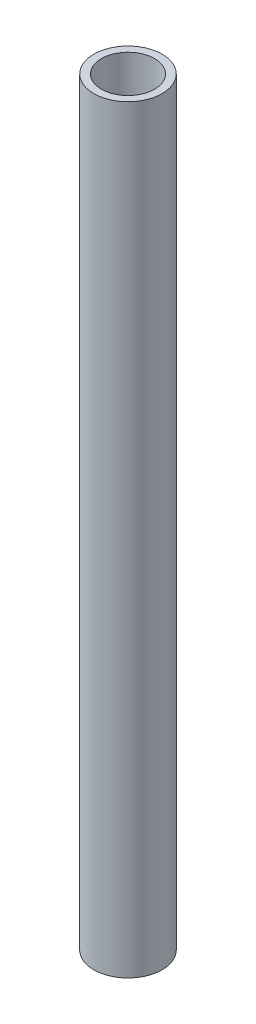
ISO-10303-21;
HEADER;
FILE_DESCRIPTION(('STEP AP214'),'2;1');
FILE_NAME('part.step','',(''),(''),'','','');
FILE_SCHEMA(('AUTOMOTIVE_DESIGN { 1 0 10303 214 1 1 1 1 }'));
ENDSEC;
DATA;
#1=APPLICATION_CONTEXT('core data for automotive mechanical design processes');
#2=APPLICATION_PROTOCOL_DEFINITION('international standard','automotive_design',2000,#1);
#3=PRODUCT_CONTEXT('',#1,'mechanical');
#4=PRODUCT('Part','Part','',(#3));
#5=PRODUCT_RELATED_PRODUCT_CATEGORY('part','',(#4));
#6=PRODUCT_DEFINITION_FORMATION('','',#4);
#7=PRODUCT_DEFINITION_CONTEXT('part definition',#1,'design');
#8=PRODUCT_DEFINITION('design','',#6,#7);
#9=PRODUCT_DEFINITION_SHAPE('','',#8);
#10=(LENGTH_UNIT() NAMED_UNIT(*) SI_UNIT(.MILLI.,.METRE.));
#11=(NAMED_UNIT(*) PLANE_ANGLE_UNIT() SI_UNIT($,.RADIAN.));
#12=(NAMED_UNIT(*) SI_UNIT($,.STERADIAN.) SOLID_ANGLE_UNIT());
#13=UNCERTAINTY_MEASURE_WITH_UNIT(LENGTH_MEASURE(1.E-05),#10,'distance_accuracy_value','');
#14=(GEOMETRIC_REPRESENTATION_CONTEXT(3) GLOBAL_UNCERTAINTY_ASSIGNED_CONTEXT((#13)) GLOBAL_UNIT_ASSIGNED_CONTEXT((#10,
#11,#12)) REPRESENTATION_CONTEXT('',''));
#15=CARTESIAN_POINT('',(0.,0.,0.));
#16=DIRECTION('',(0.,0.,1.));
#17=DIRECTION('',(1.,0.,0.));
#18=AXIS2_PLACEMENT_3D('',#15,#16,#17);
#19=CARTESIAN_POINT('',(0.,100.,0.));
#20=DIRECTION('',(0.,1.,0.));
#21=DIRECTION('',(0.,0.,1.));
#22=AXIS2_PLACEMENT_3D('',#19,#20,#21);
#23=PLANE('',#22);
#24=CARTESIAN_POINT('',(0.,100.,0.));
#25=DIRECTION('',(0.,1.,0.));
#26=DIRECTION('',(0.,0.,1.));
#27=AXIS2_PLACEMENT_3D('',#24,#25,#26);
#28=CIRCLE('',#27,4.5);
#29=CARTESIAN_POINT('',(0.,100.,4.5));
#30=VERTEX_POINT('',#29);
#31=EDGE_CURVE('E10',#30,#30,#28,.T.);
#32=ORIENTED_EDGE('',*,*,#31,.T.);
#33=EDGE_LOOP('',(#32));
#34=FACE_BOUND('',#33,.T.);
#35=CARTESIAN_POINT('',(0.,100.,0.));
#36=DIRECTION('',(0.,1.,0.));
#37=DIRECTION('',(0.,0.,1.));
#38=AXIS2_PLACEMENT_3D('',#35,#36,#37);
#39=CIRCLE('',#38,3.5);
#40=CARTESIAN_POINT('',(0.,100.,3.5));
#41=VERTEX_POINT('',#40);
#42=EDGE_CURVE('E42',#41,#41,#39,.T.);
#43=ORIENTED_EDGE('',*,*,#42,.F.);
#44=EDGE_LOOP('',(#43));
#45=FACE_BOUND('',#44,.T.);
#46=ADVANCED_FACE('F31',(#34,#45),#23,.T.);
#47=CARTESIAN_POINT('',(0.,0.,0.));
#48=DIRECTION('',(0.,1.,0.));
#49=DIRECTION('',(0.,0.,1.));
#50=AXIS2_PLACEMENT_3D('',#47,#48,#49);
#51=PLANE('',#50);
#52=CARTESIAN_POINT('',(0.,0.,0.));
#53=DIRECTION('',(0.,1.,0.));
#54=DIRECTION('',(0.,0.,1.));
#55=AXIS2_PLACEMENT_3D('',#52,#53,#54);
#56=CIRCLE('',#55,4.5);
#57=CARTESIAN_POINT('',(0.,0.,4.5));
#58=VERTEX_POINT('',#57);
#59=EDGE_CURVE('E35',#58,#58,#56,.T.);
#60=ORIENTED_EDGE('',*,*,#59,.F.);
#61=EDGE_LOOP('',(#60));
#62=FACE_BOUND('',#61,.T.);
#63=CARTESIAN_POINT('',(0.,0.,0.));
#64=DIRECTION('',(0.,1.,0.));
#65=DIRECTION('',(0.,0.,1.));
#66=AXIS2_PLACEMENT_3D('',#63,#64,#65);
#67=CIRCLE('',#66,3.5);
#68=CARTESIAN_POINT('',(0.,0.,3.5));
#69=VERTEX_POINT('',#68);
#70=EDGE_CURVE('E44',#69,#69,#67,.T.);
#71=ORIENTED_EDGE('',*,*,#70,.T.);
#72=EDGE_LOOP('',(#71));
#73=FACE_BOUND('',#72,.T.);
#74=ADVANCED_FACE('F54',(#62,#73),#51,.F.);
#75=CARTESIAN_POINT('',(0.,100.,0.));
#76=DIRECTION('',(0.,-1.,0.));
#77=DIRECTION('',(0.,0.,-1.));
#78=AXIS2_PLACEMENT_3D('',#75,#76,#77);
#79=CYLINDRICAL_SURFACE('',#78,4.5);
#80=ORIENTED_EDGE('',*,*,#31,.F.);
#81=EDGE_LOOP('',(#80));
#82=FACE_BOUND('',#81,.T.);
#83=ORIENTED_EDGE('',*,*,#59,.T.);
#84=EDGE_LOOP('',(#83));
#85=FACE_BOUND('',#84,.T.);
#86=ADVANCED_FACE('F33',(#82,#85),#79,.T.);
#87=CARTESIAN_POINT('',(0.,100.,0.));
#88=DIRECTION('',(0.,-1.,0.));
#89=DIRECTION('',(0.,0.,-1.));
#90=AXIS2_PLACEMENT_3D('',#87,#88,#89);
#91=CYLINDRICAL_SURFACE('',#90,3.5);
#92=ORIENTED_EDGE('',*,*,#42,.T.);
#93=EDGE_LOOP('',(#92));
#94=FACE_BOUND('',#93,.T.);
#95=ORIENTED_EDGE('',*,*,#70,.F.);
#96=EDGE_LOOP('',(#95));
#97=FACE_BOUND('',#96,.T.);
#98=ADVANCED_FACE('F50',(#94,#97),#91,.F.);
#99=CLOSED_SHELL('',(#46,#74,#86,#98));
#100=MANIFOLD_SOLID_BREP('B2',#99);
#101=ADVANCED_BREP_SHAPE_REPRESENTATION('',(#18,#100),#14);
#102=SHAPE_DEFINITION_REPRESENTATION(#9,#101);
ENDSEC;
END-ISO-10303-21;
